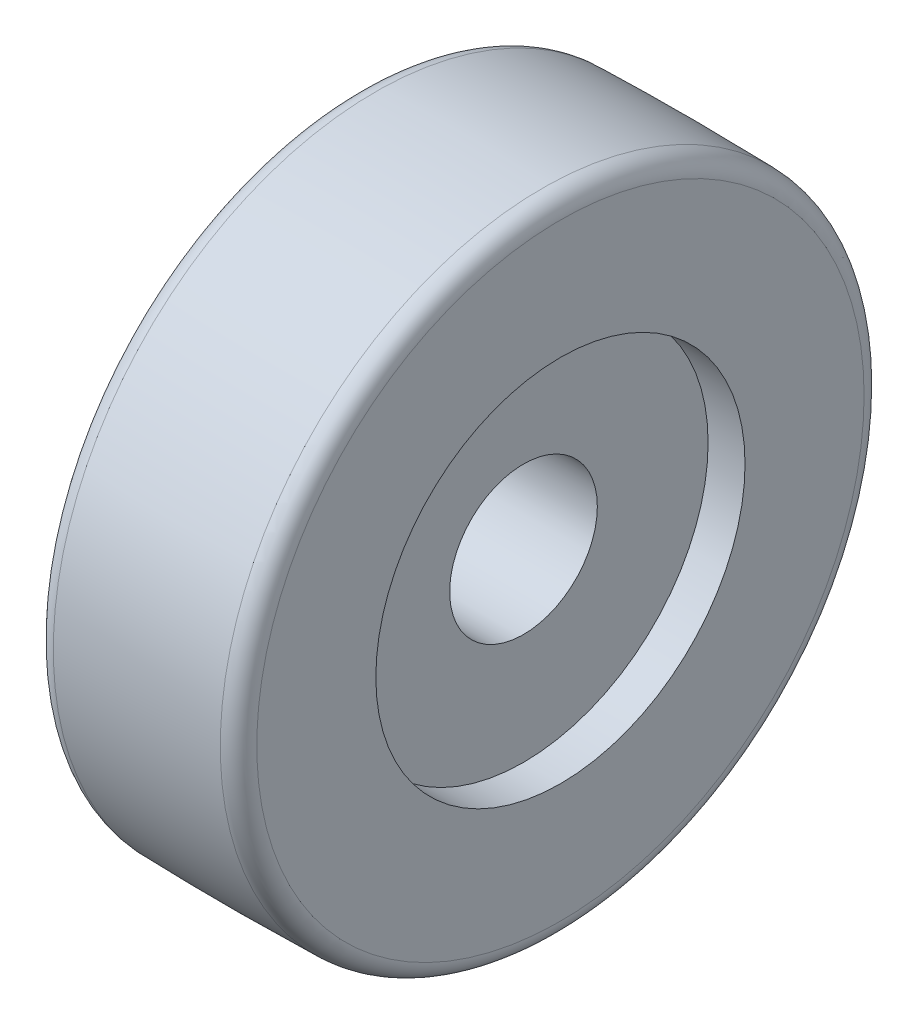
ISO-10303-21;
HEADER;
FILE_DESCRIPTION(('STEP AP214'),'2;1');
FILE_NAME('part.step','',(''),(''),'','','');
FILE_SCHEMA(('AUTOMOTIVE_DESIGN { 1 0 10303 214 1 1 1 1 }'));
ENDSEC;
DATA;
#1=APPLICATION_CONTEXT('core data for automotive mechanical design processes');
#2=APPLICATION_PROTOCOL_DEFINITION('international standard','automotive_design',2000,#1);
#3=PRODUCT_CONTEXT('',#1,'mechanical');
#4=PRODUCT('Part','Part','',(#3));
#5=PRODUCT_RELATED_PRODUCT_CATEGORY('part','',(#4));
#6=PRODUCT_DEFINITION_FORMATION('','',#4);
#7=PRODUCT_DEFINITION_CONTEXT('part definition',#1,'design');
#8=PRODUCT_DEFINITION('design','',#6,#7);
#9=PRODUCT_DEFINITION_SHAPE('','',#8);
#10=(LENGTH_UNIT() NAMED_UNIT(*) SI_UNIT(.MILLI.,.METRE.));
#11=(NAMED_UNIT(*) PLANE_ANGLE_UNIT() SI_UNIT($,.RADIAN.));
#12=(NAMED_UNIT(*) SI_UNIT($,.STERADIAN.) SOLID_ANGLE_UNIT());
#13=UNCERTAINTY_MEASURE_WITH_UNIT(LENGTH_MEASURE(1.E-05),#10,'distance_accuracy_value','');
#14=(GEOMETRIC_REPRESENTATION_CONTEXT(3) GLOBAL_UNCERTAINTY_ASSIGNED_CONTEXT((#13)) GLOBAL_UNIT_ASSIGNED_CONTEXT((#10,
#11,#12)) REPRESENTATION_CONTEXT('',''));
#15=CARTESIAN_POINT('',(0.,0.,0.));
#16=DIRECTION('',(0.,0.,1.));
#17=DIRECTION('',(1.,0.,0.));
#18=AXIS2_PLACEMENT_3D('',#15,#16,#17);
#19=CARTESIAN_POINT('',(-4.5,0.,0.));
#20=DIRECTION('',(1.,0.,0.));
#21=DIRECTION('',(0.,0.,-1.));
#22=AXIS2_PLACEMENT_3D('',#19,#20,#21);
#23=TOROIDAL_SURFACE('',#22,16.4491140970471,0.99999999999996);
#24=CARTESIAN_POINT('',(-5.5,0.,0.));
#25=DIRECTION('',(1.,0.,0.));
#26=DIRECTION('',(0.,0.,-1.));
#27=AXIS2_PLACEMENT_3D('',#24,#25,#26);
#28=CIRCLE('',#27,16.4491140970471);
#29=CARTESIAN_POINT('',(-5.5,0.,-16.4491140970471));
#30=VERTEX_POINT('',#29);
#31=EDGE_CURVE('E54',#30,#30,#28,.T.);
#32=ORIENTED_EDGE('',*,*,#31,.T.);
#33=EDGE_LOOP('',(#32));
#34=FACE_BOUND('',#33,.T.);
#35=CARTESIAN_POINT('',(-4.52261306532662,0.,0.));
#36=DIRECTION('',(1.,0.,0.));
#37=DIRECTION('',(0.,0.,-1.));
#38=AXIS2_PLACEMENT_3D('',#35,#36,#37);
#39=CIRCLE('',#38,17.448858388992);
#40=CARTESIAN_POINT('',(-4.52261306532662,0.,-17.448858388992));
#41=VERTEX_POINT('',#40);
#42=EDGE_CURVE('E47',#41,#41,#39,.T.);
#43=ORIENTED_EDGE('',*,*,#42,.F.);
#44=EDGE_LOOP('',(#43));
#45=FACE_BOUND('',#44,.T.);
#46=ADVANCED_FACE('F18',(#34,#45),#23,.T.);
#47=CARTESIAN_POINT('',(-5.5,16.449114097047,0.));
#48=DIRECTION('',(-1.,0.,0.));
#49=DIRECTION('',(0.,0.,1.));
#50=AXIS2_PLACEMENT_3D('',#47,#48,#49);
#51=PLANE('',#50);
#52=CARTESIAN_POINT('',(-5.5,0.,0.));
#53=DIRECTION('',(1.,0.,0.));
#54=DIRECTION('',(0.,0.,-1.));
#55=AXIS2_PLACEMENT_3D('',#52,#53,#54);
#56=CIRCLE('',#55,10.);
#57=CARTESIAN_POINT('',(-5.5,0.,-10.));
#58=VERTEX_POINT('',#57);
#59=EDGE_CURVE('E53',#58,#58,#56,.T.);
#60=ORIENTED_EDGE('',*,*,#59,.T.);
#61=EDGE_LOOP('',(#60));
#62=FACE_BOUND('',#61,.T.);
#63=ORIENTED_EDGE('',*,*,#31,.F.);
#64=EDGE_LOOP('',(#63));
#65=FACE_BOUND('',#64,.T.);
#66=ADVANCED_FACE('F97',(#62,#65),#51,.T.);
#67=CARTESIAN_POINT('',(-7.87289070741659E-11,0.,0.));
#68=DIRECTION('',(1.,0.,0.));
#69=DIRECTION('',(0.,0.,-1.));
#70=AXIS2_PLACEMENT_3D('',#67,#68,#69);
#71=DEGENERATE_TOROIDAL_SURFACE('',#70,182.499999991458,199.999999991459,.F.);
#72=ORIENTED_EDGE('',*,*,#42,.T.);
#73=EDGE_LOOP('',(#72));
#74=FACE_BOUND('',#73,.T.);
#75=CARTESIAN_POINT('',(4.5226133363602,0.,0.));
#76=DIRECTION('',(1.,0.,0.));
#77=DIRECTION('',(0.,0.,-1.));
#78=AXIS2_PLACEMENT_3D('',#75,#76,#77);
#79=CIRCLE('',#78,17.448858382862);
#80=CARTESIAN_POINT('',(4.5226133363602,0.,-17.448858382862));
#81=VERTEX_POINT('',#80);
#82=EDGE_CURVE('E59',#81,#81,#79,.T.);
#83=ORIENTED_EDGE('',*,*,#82,.F.);
#84=EDGE_LOOP('',(#83));
#85=FACE_BOUND('',#84,.T.);
#86=ADVANCED_FACE('F102',(#74,#85),#71,.F.);
#87=CARTESIAN_POINT('',(5.5,0.,0.));
#88=DIRECTION('',(1.,0.,0.));
#89=DIRECTION('',(0.,0.,-1.));
#90=AXIS2_PLACEMENT_3D('',#87,#88,#89);
#91=CYLINDRICAL_SURFACE('',#90,10.);
#92=CARTESIAN_POINT('',(-3.5,0.,0.));
#93=DIRECTION('',(1.,0.,0.));
#94=DIRECTION('',(0.,0.,-1.));
#95=AXIS2_PLACEMENT_3D('',#92,#93,#94);
#96=CIRCLE('',#95,10.);
#97=CARTESIAN_POINT('',(-3.5,0.,-10.));
#98=VERTEX_POINT('',#97);
#99=EDGE_CURVE('E67',#98,#98,#96,.T.);
#100=ORIENTED_EDGE('',*,*,#99,.T.);
#101=EDGE_LOOP('',(#100));
#102=FACE_BOUND('',#101,.T.);
#103=ORIENTED_EDGE('',*,*,#59,.F.);
#104=EDGE_LOOP('',(#103));
#105=FACE_BOUND('',#104,.T.);
#106=ADVANCED_FACE('F110',(#102,#105),#91,.F.);
#107=CARTESIAN_POINT('',(4.49999999999915,0.,0.));
#108=DIRECTION('',(1.,0.,0.));
#109=DIRECTION('',(0.,0.,-1.));
#110=AXIS2_PLACEMENT_3D('',#107,#108,#109);
#111=TOROIDAL_SURFACE('',#110,16.4491140970467,1.00000000000085);
#112=ORIENTED_EDGE('',*,*,#82,.T.);
#113=EDGE_LOOP('',(#112));
#114=FACE_BOUND('',#113,.T.);
#115=CARTESIAN_POINT('',(5.5,0.,0.));
#116=DIRECTION('',(1.,0.,0.));
#117=DIRECTION('',(0.,0.,-1.));
#118=AXIS2_PLACEMENT_3D('',#115,#116,#117);
#119=CIRCLE('',#118,16.4491140970467);
#120=CARTESIAN_POINT('',(5.5,0.,-16.4491140970467));
#121=VERTEX_POINT('',#120);
#122=EDGE_CURVE('E72',#121,#121,#119,.T.);
#123=ORIENTED_EDGE('',*,*,#122,.F.);
#124=EDGE_LOOP('',(#123));
#125=FACE_BOUND('',#124,.T.);
#126=ADVANCED_FACE('F114',(#114,#125),#111,.T.);
#127=CARTESIAN_POINT('',(-3.5,10.,0.));
#128=DIRECTION('',(-1.,0.,0.));
#129=DIRECTION('',(0.,0.,1.));
#130=AXIS2_PLACEMENT_3D('',#127,#128,#129);
#131=PLANE('',#130);
#132=CARTESIAN_POINT('',(-3.5,0.,0.));
#133=DIRECTION('',(1.,0.,0.));
#134=DIRECTION('',(0.,0.,-1.));
#135=AXIS2_PLACEMENT_3D('',#132,#133,#134);
#136=CIRCLE('',#135,4.);
#137=CARTESIAN_POINT('',(-3.5,0.,-4.));
#138=VERTEX_POINT('',#137);
#139=EDGE_CURVE('E38',#138,#138,#136,.T.);
#140=ORIENTED_EDGE('',*,*,#139,.T.);
#141=EDGE_LOOP('',(#140));
#142=FACE_BOUND('',#141,.T.);
#143=ORIENTED_EDGE('',*,*,#99,.F.);
#144=EDGE_LOOP('',(#143));
#145=FACE_BOUND('',#144,.T.);
#146=ADVANCED_FACE('F81',(#142,#145),#131,.T.);
#147=CARTESIAN_POINT('',(5.5,10.,0.));
#148=DIRECTION('',(1.,0.,0.));
#149=DIRECTION('',(0.,0.,-1.));
#150=AXIS2_PLACEMENT_3D('',#147,#148,#149);
#151=PLANE('',#150);
#152=ORIENTED_EDGE('',*,*,#122,.T.);
#153=EDGE_LOOP('',(#152));
#154=FACE_BOUND('',#153,.T.);
#155=CARTESIAN_POINT('',(5.5,0.,0.));
#156=DIRECTION('',(1.,0.,0.));
#157=DIRECTION('',(0.,0.,-1.));
#158=AXIS2_PLACEMENT_3D('',#155,#156,#157);
#159=CIRCLE('',#158,10.);
#160=CARTESIAN_POINT('',(5.5,0.,-10.));
#161=VERTEX_POINT('',#160);
#162=EDGE_CURVE('E33',#161,#161,#159,.T.);
#163=ORIENTED_EDGE('',*,*,#162,.F.);
#164=EDGE_LOOP('',(#163));
#165=FACE_BOUND('',#164,.T.);
#166=ADVANCED_FACE('F87',(#154,#165),#151,.T.);
#167=CARTESIAN_POINT('',(5.5,0.,0.));
#168=DIRECTION('',(1.,0.,0.));
#169=DIRECTION('',(0.,0.,-1.));
#170=AXIS2_PLACEMENT_3D('',#167,#168,#169);
#171=CYLINDRICAL_SURFACE('',#170,4.);
#172=CARTESIAN_POINT('',(3.5,0.,0.));
#173=DIRECTION('',(1.,0.,0.));
#174=DIRECTION('',(0.,0.,-1.));
#175=AXIS2_PLACEMENT_3D('',#172,#173,#174);
#176=CIRCLE('',#175,4.);
#177=CARTESIAN_POINT('',(3.5,0.,-4.));
#178=VERTEX_POINT('',#177);
#179=EDGE_CURVE('E27',#178,#178,#176,.T.);
#180=ORIENTED_EDGE('',*,*,#179,.T.);
#181=EDGE_LOOP('',(#180));
#182=FACE_BOUND('',#181,.T.);
#183=ORIENTED_EDGE('',*,*,#139,.F.);
#184=EDGE_LOOP('',(#183));
#185=FACE_BOUND('',#184,.T.);
#186=ADVANCED_FACE('F84',(#182,#185),#171,.F.);
#187=CARTESIAN_POINT('',(5.5,0.,0.));
#188=DIRECTION('',(1.,0.,0.));
#189=DIRECTION('',(0.,0.,-1.));
#190=AXIS2_PLACEMENT_3D('',#187,#188,#189);
#191=CYLINDRICAL_SURFACE('',#190,10.);
#192=ORIENTED_EDGE('',*,*,#162,.T.);
#193=EDGE_LOOP('',(#192));
#194=FACE_BOUND('',#193,.T.);
#195=CARTESIAN_POINT('',(3.5,0.,0.));
#196=DIRECTION('',(1.,0.,0.));
#197=DIRECTION('',(0.,0.,-1.));
#198=AXIS2_PLACEMENT_3D('',#195,#196,#197);
#199=CIRCLE('',#198,10.);
#200=CARTESIAN_POINT('',(3.5,0.,-10.));
#201=VERTEX_POINT('',#200);
#202=EDGE_CURVE('E11',#201,#201,#199,.T.);
#203=ORIENTED_EDGE('',*,*,#202,.F.);
#204=EDGE_LOOP('',(#203));
#205=FACE_BOUND('',#204,.T.);
#206=ADVANCED_FACE('F86',(#194,#205),#191,.F.);
#207=CARTESIAN_POINT('',(3.5,4.,0.));
#208=DIRECTION('',(1.,0.,0.));
#209=DIRECTION('',(0.,0.,-1.));
#210=AXIS2_PLACEMENT_3D('',#207,#208,#209);
#211=PLANE('',#210);
#212=ORIENTED_EDGE('',*,*,#202,.T.);
#213=EDGE_LOOP('',(#212));
#214=FACE_BOUND('',#213,.T.);
#215=ORIENTED_EDGE('',*,*,#179,.F.);
#216=EDGE_LOOP('',(#215));
#217=FACE_BOUND('',#216,.T.);
#218=ADVANCED_FACE('F20',(#214,#217),#211,.T.);
#219=CLOSED_SHELL('',(#46,#66,#86,#106,#126,#146,#166,#186,#206,#218));
#220=MANIFOLD_SOLID_BREP('B1',#219);
#221=ADVANCED_BREP_SHAPE_REPRESENTATION('',(#18,#220),#14);
#222=SHAPE_DEFINITION_REPRESENTATION(#9,#221);
ENDSEC;
END-ISO-10303-21;
